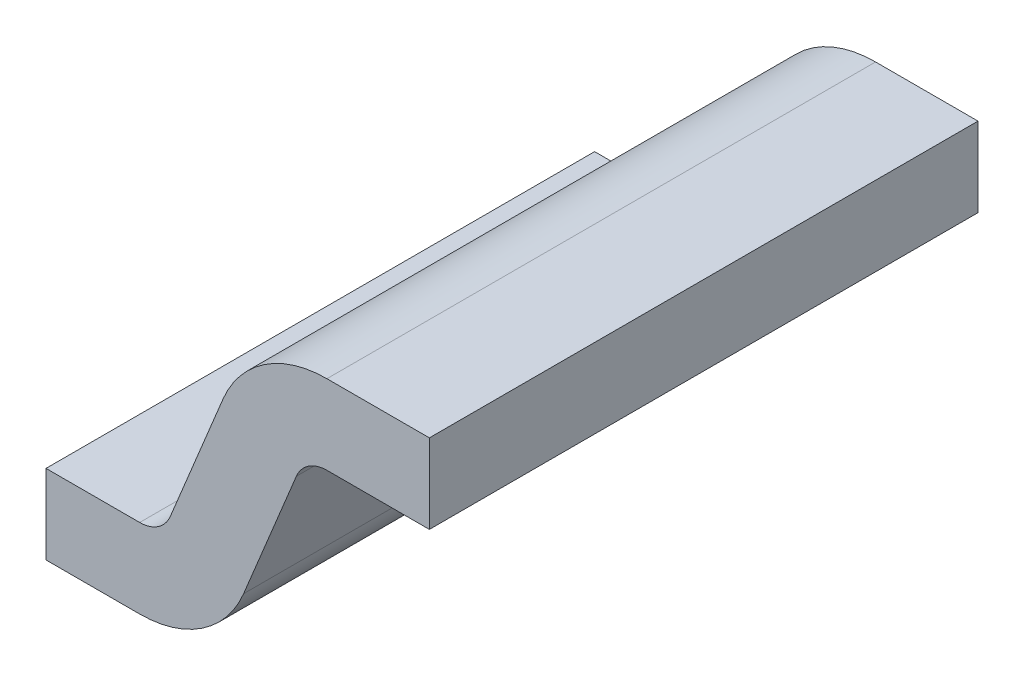
ISO-10303-21;
HEADER;
FILE_DESCRIPTION(('STEP AP214'),'2;1');
FILE_NAME('part.step','',(''),(''),'','','');
FILE_SCHEMA(('AUTOMOTIVE_DESIGN { 1 0 10303 214 1 1 1 1 }'));
ENDSEC;
DATA;
#1=APPLICATION_CONTEXT('core data for automotive mechanical design processes');
#2=APPLICATION_PROTOCOL_DEFINITION('international standard','automotive_design',2000,#1);
#3=PRODUCT_CONTEXT('',#1,'mechanical');
#4=PRODUCT('Part','Part','',(#3));
#5=PRODUCT_RELATED_PRODUCT_CATEGORY('part','',(#4));
#6=PRODUCT_DEFINITION_FORMATION('','',#4);
#7=PRODUCT_DEFINITION_CONTEXT('part definition',#1,'design');
#8=PRODUCT_DEFINITION('design','',#6,#7);
#9=PRODUCT_DEFINITION_SHAPE('','',#8);
#10=(LENGTH_UNIT() NAMED_UNIT(*) SI_UNIT(.MILLI.,.METRE.));
#11=(NAMED_UNIT(*) PLANE_ANGLE_UNIT() SI_UNIT($,.RADIAN.));
#12=(NAMED_UNIT(*) SI_UNIT($,.STERADIAN.) SOLID_ANGLE_UNIT());
#13=UNCERTAINTY_MEASURE_WITH_UNIT(LENGTH_MEASURE(1.E-05),#10,'distance_accuracy_value','');
#14=(GEOMETRIC_REPRESENTATION_CONTEXT(3) GLOBAL_UNCERTAINTY_ASSIGNED_CONTEXT((#13)) GLOBAL_UNIT_ASSIGNED_CONTEXT((#10,
#11,#12)) REPRESENTATION_CONTEXT('',''));
#15=CARTESIAN_POINT('',(0.,0.,0.));
#16=DIRECTION('',(0.,0.,1.));
#17=DIRECTION('',(1.,0.,0.));
#18=AXIS2_PLACEMENT_3D('',#15,#16,#17);
#19=CARTESIAN_POINT('',(-0.155,-0.05,0.));
#20=DIRECTION('',(0.,0.,1.));
#21=DIRECTION('',(1.,0.,0.));
#22=AXIS2_PLACEMENT_3D('',#19,#20,#21);
#23=PLANE('',#22);
#24=DIRECTION('',(0.,1.,0.));
#25=VECTOR('',#24,1.);
#26=CARTESIAN_POINT('',(0.,0.12,0.));
#27=LINE('',#26,#25);
#28=CARTESIAN_POINT('',(0.,0.,0.));
#29=VERTEX_POINT('',#28);
#30=CARTESIAN_POINT('',(0.,0.12,0.));
#31=VERTEX_POINT('',#30);
#32=EDGE_CURVE('E141',#29,#31,#27,.T.);
#33=ORIENTED_EDGE('',*,*,#32,.F.);
#34=DIRECTION('',(1.,0.,0.));
#35=VECTOR('',#34,1.);
#36=CARTESIAN_POINT('',(-0.155,0.,0.));
#37=LINE('',#36,#35);
#38=CARTESIAN_POINT('',(-0.155,0.,0.));
#39=VERTEX_POINT('',#38);
#40=EDGE_CURVE('E19',#39,#29,#37,.T.);
#41=ORIENTED_EDGE('',*,*,#40,.F.);
#42=CARTESIAN_POINT('',(-0.155,-0.05,0.));
#43=DIRECTION('',(0.,0.,-1.));
#44=DIRECTION('',(1.,0.,0.));
#45=AXIS2_PLACEMENT_3D('',#42,#43,#44);
#46=CIRCLE('',#45,0.05);
#47=CARTESIAN_POINT('',(-0.201231129660025,-0.0309557712060072,0.));
#48=VERTEX_POINT('',#47);
#49=EDGE_CURVE('E179',#48,#39,#46,.T.);
#50=ORIENTED_EDGE('',*,*,#49,.F.);
#51=DIRECTION('',(0.380884575879857,0.924622593200502,0.));
#52=VECTOR('',#51,1.);
#53=CARTESIAN_POINT('',(-0.281061946169478,-0.224750377899576,0.));
#54=LINE('',#53,#52);
#55=CARTESIAN_POINT('',(-0.281061946169478,-0.224750377899576,0.));
#56=VERTEX_POINT('',#55);
#57=EDGE_CURVE('E205',#56,#48,#54,.T.);
#58=ORIENTED_EDGE('',*,*,#57,.F.);
#59=CARTESIAN_POINT('',(-0.438247787013563,-0.16,0.));
#60=DIRECTION('',(0.,0.,1.));
#61=DIRECTION('',(1.,0.,0.));
#62=AXIS2_PLACEMENT_3D('',#59,#60,#61);
#63=CIRCLE('',#62,0.17);
#64=CARTESIAN_POINT('',(-0.438247787013563,-0.33,0.));
#65=VERTEX_POINT('',#64);
#66=EDGE_CURVE('E251',#65,#56,#63,.T.);
#67=ORIENTED_EDGE('',*,*,#66,.F.);
#68=DIRECTION('',(1.,0.,0.));
#69=VECTOR('',#68,1.);
#70=CARTESIAN_POINT('',(-0.58,-0.33,0.));
#71=LINE('',#70,#69);
#72=CARTESIAN_POINT('',(-0.58,-0.33,0.));
#73=VERTEX_POINT('',#72);
#74=EDGE_CURVE('E241',#73,#65,#71,.T.);
#75=ORIENTED_EDGE('',*,*,#74,.F.);
#76=DIRECTION('',(0.,-1.,0.));
#77=VECTOR('',#76,1.);
#78=CARTESIAN_POINT('',(-0.58,-0.21,0.));
#79=LINE('',#78,#77);
#80=CARTESIAN_POINT('',(-0.58,-0.21,0.));
#81=VERTEX_POINT('',#80);
#82=EDGE_CURVE('E228',#81,#73,#79,.T.);
#83=ORIENTED_EDGE('',*,*,#82,.F.);
#84=DIRECTION('',(-1.,0.,0.));
#85=VECTOR('',#84,1.);
#86=CARTESIAN_POINT('',(-0.438247787013563,-0.21,0.));
#87=LINE('',#86,#85);
#88=CARTESIAN_POINT('',(-0.438247787013563,-0.21,0.));
#89=VERTEX_POINT('',#88);
#90=EDGE_CURVE('E169',#89,#81,#87,.T.);
#91=ORIENTED_EDGE('',*,*,#90,.F.);
#92=CARTESIAN_POINT('',(-0.438247787013563,-0.16,0.));
#93=DIRECTION('',(0.,0.,-1.));
#94=DIRECTION('',(1.,0.,0.));
#95=AXIS2_PLACEMENT_3D('',#92,#93,#94);
#96=CIRCLE('',#95,0.05);
#97=CARTESIAN_POINT('',(-0.392016657353538,-0.179044228793993,0.));
#98=VERTEX_POINT('',#97);
#99=EDGE_CURVE('E197',#98,#89,#96,.T.);
#100=ORIENTED_EDGE('',*,*,#99,.F.);
#101=DIRECTION('',(-0.380884575879857,-0.924622593200502,0.));
#102=VECTOR('',#101,1.);
#103=CARTESIAN_POINT('',(-0.312185840844085,0.0147503778995758,0.));
#104=LINE('',#103,#102);
#105=CARTESIAN_POINT('',(-0.312185840844085,0.0147503778995758,0.));
#106=VERTEX_POINT('',#105);
#107=EDGE_CURVE('E198',#106,#98,#104,.T.);
#108=ORIENTED_EDGE('',*,*,#107,.F.);
#109=CARTESIAN_POINT('',(-0.155,-0.05,0.));
#110=DIRECTION('',(0.,0.,1.));
#111=DIRECTION('',(1.,0.,0.));
#112=AXIS2_PLACEMENT_3D('',#109,#110,#111);
#113=CIRCLE('',#112,0.17);
#114=CARTESIAN_POINT('',(-0.155,0.12,0.));
#115=VERTEX_POINT('',#114);
#116=EDGE_CURVE('E185',#115,#106,#113,.T.);
#117=ORIENTED_EDGE('',*,*,#116,.F.);
#118=DIRECTION('',(-1.,0.,0.));
#119=VECTOR('',#118,1.);
#120=CARTESIAN_POINT('',(0.,0.12,0.));
#121=LINE('',#120,#119);
#122=EDGE_CURVE('E150',#31,#115,#121,.T.);
#123=ORIENTED_EDGE('',*,*,#122,.F.);
#124=EDGE_LOOP('',(#33,#41,#50,#58,#67,#75,#83,#91,#100,#108,#117,#123));
#125=FACE_BOUND('',#124,.T.);
#126=ADVANCED_FACE('F16',(#125),#23,.F.);
#127=CARTESIAN_POINT('',(-0.155,-0.05,0.83));
#128=DIRECTION('',(0.,0.,1.));
#129=DIRECTION('',(1.,0.,0.));
#130=AXIS2_PLACEMENT_3D('',#127,#128,#129);
#131=PLANE('',#130);
#132=DIRECTION('',(0.,1.,0.));
#133=VECTOR('',#132,1.);
#134=CARTESIAN_POINT('',(0.,0.12,0.83));
#135=LINE('',#134,#133);
#136=CARTESIAN_POINT('',(0.,0.,0.83));
#137=VERTEX_POINT('',#136);
#138=CARTESIAN_POINT('',(0.,0.12,0.83));
#139=VERTEX_POINT('',#138);
#140=EDGE_CURVE('E144',#137,#139,#135,.T.);
#141=ORIENTED_EDGE('',*,*,#140,.T.);
#142=DIRECTION('',(-1.,0.,0.));
#143=VECTOR('',#142,1.);
#144=CARTESIAN_POINT('',(0.,0.12,0.83));
#145=LINE('',#144,#143);
#146=CARTESIAN_POINT('',(-0.155,0.12,0.83));
#147=VERTEX_POINT('',#146);
#148=EDGE_CURVE('E174',#139,#147,#145,.T.);
#149=ORIENTED_EDGE('',*,*,#148,.T.);
#150=CARTESIAN_POINT('',(-0.155,-0.05,0.83));
#151=DIRECTION('',(0.,0.,1.));
#152=DIRECTION('',(1.,0.,0.));
#153=AXIS2_PLACEMENT_3D('',#150,#151,#152);
#154=CIRCLE('',#153,0.17);
#155=CARTESIAN_POINT('',(-0.312185840844085,0.0147503778995758,0.83));
#156=VERTEX_POINT('',#155);
#157=EDGE_CURVE('E188',#147,#156,#154,.T.);
#158=ORIENTED_EDGE('',*,*,#157,.T.);
#159=DIRECTION('',(-0.380884575879857,-0.924622593200502,0.));
#160=VECTOR('',#159,1.);
#161=CARTESIAN_POINT('',(-0.312185840844085,0.0147503778995758,0.83));
#162=LINE('',#161,#160);
#163=CARTESIAN_POINT('',(-0.392016657353538,-0.179044228793993,0.83));
#164=VERTEX_POINT('',#163);
#165=EDGE_CURVE('E203',#156,#164,#162,.T.);
#166=ORIENTED_EDGE('',*,*,#165,.T.);
#167=CARTESIAN_POINT('',(-0.438247787013563,-0.16,0.83));
#168=DIRECTION('',(0.,0.,-1.));
#169=DIRECTION('',(1.,0.,0.));
#170=AXIS2_PLACEMENT_3D('',#167,#168,#169);
#171=CIRCLE('',#170,0.05);
#172=CARTESIAN_POINT('',(-0.438247787013563,-0.21,0.83));
#173=VERTEX_POINT('',#172);
#174=EDGE_CURVE('E163',#164,#173,#171,.T.);
#175=ORIENTED_EDGE('',*,*,#174,.T.);
#176=DIRECTION('',(-1.,0.,0.));
#177=VECTOR('',#176,1.);
#178=CARTESIAN_POINT('',(-0.438247787013563,-0.21,0.83));
#179=LINE('',#178,#177);
#180=CARTESIAN_POINT('',(-0.58,-0.21,0.83));
#181=VERTEX_POINT('',#180);
#182=EDGE_CURVE('E223',#173,#181,#179,.T.);
#183=ORIENTED_EDGE('',*,*,#182,.T.);
#184=DIRECTION('',(0.,-1.,0.));
#185=VECTOR('',#184,1.);
#186=CARTESIAN_POINT('',(-0.58,-0.21,0.83));
#187=LINE('',#186,#185);
#188=CARTESIAN_POINT('',(-0.58,-0.33,0.83));
#189=VERTEX_POINT('',#188);
#190=EDGE_CURVE('E236',#181,#189,#187,.T.);
#191=ORIENTED_EDGE('',*,*,#190,.T.);
#192=DIRECTION('',(1.,0.,0.));
#193=VECTOR('',#192,1.);
#194=CARTESIAN_POINT('',(-0.58,-0.33,0.83));
#195=LINE('',#194,#193);
#196=CARTESIAN_POINT('',(-0.438247787013563,-0.33,0.83));
#197=VERTEX_POINT('',#196);
#198=EDGE_CURVE('E247',#189,#197,#195,.T.);
#199=ORIENTED_EDGE('',*,*,#198,.T.);
#200=CARTESIAN_POINT('',(-0.438247787013563,-0.16,0.83));
#201=DIRECTION('',(0.,0.,1.));
#202=DIRECTION('',(1.,0.,0.));
#203=AXIS2_PLACEMENT_3D('',#200,#201,#202);
#204=CIRCLE('',#203,0.17);
#205=CARTESIAN_POINT('',(-0.281061946169478,-0.224750377899576,0.83));
#206=VERTEX_POINT('',#205);
#207=EDGE_CURVE('E210',#197,#206,#204,.T.);
#208=ORIENTED_EDGE('',*,*,#207,.T.);
#209=DIRECTION('',(0.380884575879857,0.924622593200502,0.));
#210=VECTOR('',#209,1.);
#211=CARTESIAN_POINT('',(-0.281061946169478,-0.224750377899576,0.83));
#212=LINE('',#211,#210);
#213=CARTESIAN_POINT('',(-0.201231129660025,-0.0309557712060072,0.83));
#214=VERTEX_POINT('',#213);
#215=EDGE_CURVE('E270',#206,#214,#212,.T.);
#216=ORIENTED_EDGE('',*,*,#215,.T.);
#217=CARTESIAN_POINT('',(-0.155,-0.05,0.83));
#218=DIRECTION('',(0.,0.,-1.));
#219=DIRECTION('',(1.,0.,0.));
#220=AXIS2_PLACEMENT_3D('',#217,#218,#219);
#221=CIRCLE('',#220,0.05);
#222=CARTESIAN_POINT('',(-0.155,0.,0.83));
#223=VERTEX_POINT('',#222);
#224=EDGE_CURVE('E138',#214,#223,#221,.T.);
#225=ORIENTED_EDGE('',*,*,#224,.T.);
#226=DIRECTION('',(1.,0.,0.));
#227=VECTOR('',#226,1.);
#228=CARTESIAN_POINT('',(-0.155,0.,0.83));
#229=LINE('',#228,#227);
#230=EDGE_CURVE('E11',#223,#137,#229,.T.);
#231=ORIENTED_EDGE('',*,*,#230,.T.);
#232=EDGE_LOOP('',(#141,#149,#158,#166,#175,#183,#191,#199,#208,#216,#225,#231));
#233=FACE_BOUND('',#232,.T.);
#234=ADVANCED_FACE('F304',(#233),#131,.T.);
#235=CARTESIAN_POINT('',(-0.155,0.,0.83));
#236=DIRECTION('',(0.,1.,0.));
#237=DIRECTION('',(1.,0.,0.));
#238=AXIS2_PLACEMENT_3D('',#235,#236,#237);
#239=PLANE('',#238);
#240=ORIENTED_EDGE('',*,*,#40,.T.);
#241=DIRECTION('',(0.,0.,-1.));
#242=VECTOR('',#241,1.);
#243=CARTESIAN_POINT('',(0.,0.,0.83));
#244=LINE('',#243,#242);
#245=EDGE_CURVE('E135',#137,#29,#244,.T.);
#246=ORIENTED_EDGE('',*,*,#245,.F.);
#247=ORIENTED_EDGE('',*,*,#230,.F.);
#248=DIRECTION('',(0.,0.,-1.));
#249=VECTOR('',#248,1.);
#250=CARTESIAN_POINT('',(-0.155,0.,0.83));
#251=LINE('',#250,#249);
#252=EDGE_CURVE('E134',#223,#39,#251,.T.);
#253=ORIENTED_EDGE('',*,*,#252,.T.);
#254=EDGE_LOOP('',(#240,#246,#247,#253));
#255=FACE_BOUND('',#254,.T.);
#256=ADVANCED_FACE('F131',(#255),#239,.F.);
#257=CARTESIAN_POINT('',(-0.155,-0.05,0.83));
#258=DIRECTION('',(0.,0.,-1.));
#259=DIRECTION('',(-1.,0.,0.));
#260=AXIS2_PLACEMENT_3D('',#257,#258,#259);
#261=CYLINDRICAL_SURFACE('',#260,0.05);
#262=ORIENTED_EDGE('',*,*,#49,.T.);
#263=ORIENTED_EDGE('',*,*,#252,.F.);
#264=ORIENTED_EDGE('',*,*,#224,.F.);
#265=DIRECTION('',(0.,0.,-1.));
#266=VECTOR('',#265,1.);
#267=CARTESIAN_POINT('',(-0.201231129660025,-0.0309557712060072,0.83));
#268=LINE('',#267,#266);
#269=EDGE_CURVE('E206',#214,#48,#268,.T.);
#270=ORIENTED_EDGE('',*,*,#269,.T.);
#271=EDGE_LOOP('',(#262,#263,#264,#270));
#272=FACE_BOUND('',#271,.T.);
#273=ADVANCED_FACE('F273',(#272),#261,.F.);
#274=CARTESIAN_POINT('',(-0.281061946169478,-0.224750377899576,0.83));
#275=DIRECTION('',(-0.924622593200502,0.380884575879857,0.));
#276=DIRECTION('',(0.,0.,1.));
#277=AXIS2_PLACEMENT_3D('',#274,#275,#276);
#278=PLANE('',#277);
#279=ORIENTED_EDGE('',*,*,#57,.T.);
#280=ORIENTED_EDGE('',*,*,#269,.F.);
#281=ORIENTED_EDGE('',*,*,#215,.F.);
#282=DIRECTION('',(0.,0.,-1.));
#283=VECTOR('',#282,1.);
#284=CARTESIAN_POINT('',(-0.281061946169478,-0.224750377899576,0.83));
#285=LINE('',#284,#283);
#286=EDGE_CURVE('E260',#206,#56,#285,.T.);
#287=ORIENTED_EDGE('',*,*,#286,.T.);
#288=EDGE_LOOP('',(#279,#280,#281,#287));
#289=FACE_BOUND('',#288,.T.);
#290=ADVANCED_FACE('F279',(#289),#278,.F.);
#291=CARTESIAN_POINT('',(-0.438247787013563,-0.16,0.83));
#292=DIRECTION('',(0.,0.,-1.));
#293=DIRECTION('',(-1.,0.,0.));
#294=AXIS2_PLACEMENT_3D('',#291,#292,#293);
#295=CYLINDRICAL_SURFACE('',#294,0.17);
#296=ORIENTED_EDGE('',*,*,#66,.T.);
#297=ORIENTED_EDGE('',*,*,#286,.F.);
#298=ORIENTED_EDGE('',*,*,#207,.F.);
#299=DIRECTION('',(0.,0.,-1.));
#300=VECTOR('',#299,1.);
#301=CARTESIAN_POINT('',(-0.438247787013563,-0.33,0.83));
#302=LINE('',#301,#300);
#303=EDGE_CURVE('E244',#197,#65,#302,.T.);
#304=ORIENTED_EDGE('',*,*,#303,.T.);
#305=EDGE_LOOP('',(#296,#297,#298,#304));
#306=FACE_BOUND('',#305,.T.);
#307=ADVANCED_FACE('F278',(#306),#295,.T.);
#308=CARTESIAN_POINT('',(-0.58,-0.33,0.83));
#309=DIRECTION('',(0.,1.,0.));
#310=DIRECTION('',(1.,0.,0.));
#311=AXIS2_PLACEMENT_3D('',#308,#309,#310);
#312=PLANE('',#311);
#313=ORIENTED_EDGE('',*,*,#74,.T.);
#314=ORIENTED_EDGE('',*,*,#303,.F.);
#315=ORIENTED_EDGE('',*,*,#198,.F.);
#316=DIRECTION('',(0.,0.,-1.));
#317=VECTOR('',#316,1.);
#318=CARTESIAN_POINT('',(-0.58,-0.33,0.83));
#319=LINE('',#318,#317);
#320=EDGE_CURVE('E233',#189,#73,#319,.T.);
#321=ORIENTED_EDGE('',*,*,#320,.T.);
#322=EDGE_LOOP('',(#313,#314,#315,#321));
#323=FACE_BOUND('',#322,.T.);
#324=ADVANCED_FACE('F284',(#323),#312,.F.);
#325=CARTESIAN_POINT('',(-0.58,-0.21,0.83));
#326=DIRECTION('',(1.,0.,0.));
#327=DIRECTION('',(0.,1.,0.));
#328=AXIS2_PLACEMENT_3D('',#325,#326,#327);
#329=PLANE('',#328);
#330=ORIENTED_EDGE('',*,*,#82,.T.);
#331=ORIENTED_EDGE('',*,*,#320,.F.);
#332=ORIENTED_EDGE('',*,*,#190,.F.);
#333=DIRECTION('',(0.,0.,-1.));
#334=VECTOR('',#333,1.);
#335=CARTESIAN_POINT('',(-0.58,-0.21,0.83));
#336=LINE('',#335,#334);
#337=EDGE_CURVE('E222',#181,#81,#336,.T.);
#338=ORIENTED_EDGE('',*,*,#337,.T.);
#339=EDGE_LOOP('',(#330,#331,#332,#338));
#340=FACE_BOUND('',#339,.T.);
#341=ADVANCED_FACE('F288',(#340),#329,.F.);
#342=CARTESIAN_POINT('',(-0.438247787013563,-0.21,0.83));
#343=DIRECTION('',(0.,-1.,0.));
#344=DIRECTION('',(0.,0.,-1.));
#345=AXIS2_PLACEMENT_3D('',#342,#343,#344);
#346=PLANE('',#345);
#347=ORIENTED_EDGE('',*,*,#90,.T.);
#348=ORIENTED_EDGE('',*,*,#337,.F.);
#349=ORIENTED_EDGE('',*,*,#182,.F.);
#350=DIRECTION('',(0.,0.,-1.));
#351=VECTOR('',#350,1.);
#352=CARTESIAN_POINT('',(-0.438247787013563,-0.21,0.83));
#353=LINE('',#352,#351);
#354=EDGE_CURVE('E161',#173,#89,#353,.T.);
#355=ORIENTED_EDGE('',*,*,#354,.T.);
#356=EDGE_LOOP('',(#347,#348,#349,#355));
#357=FACE_BOUND('',#356,.T.);
#358=ADVANCED_FACE('F289',(#357),#346,.F.);
#359=CARTESIAN_POINT('',(-0.438247787013563,-0.16,0.83));
#360=DIRECTION('',(0.,0.,-1.));
#361=DIRECTION('',(-1.,0.,0.));
#362=AXIS2_PLACEMENT_3D('',#359,#360,#361);
#363=CYLINDRICAL_SURFACE('',#362,0.05);
#364=ORIENTED_EDGE('',*,*,#99,.T.);
#365=ORIENTED_EDGE('',*,*,#354,.F.);
#366=ORIENTED_EDGE('',*,*,#174,.F.);
#367=DIRECTION('',(0.,0.,-1.));
#368=VECTOR('',#367,1.);
#369=CARTESIAN_POINT('',(-0.392016657353538,-0.179044228793993,0.83));
#370=LINE('',#369,#368);
#371=EDGE_CURVE('E211',#164,#98,#370,.T.);
#372=ORIENTED_EDGE('',*,*,#371,.T.);
#373=EDGE_LOOP('',(#364,#365,#366,#372));
#374=FACE_BOUND('',#373,.T.);
#375=ADVANCED_FACE('F292',(#374),#363,.F.);
#376=CARTESIAN_POINT('',(-0.312185840844085,0.0147503778995758,0.83));
#377=DIRECTION('',(0.924622593200502,-0.380884575879857,0.));
#378=DIRECTION('',(0.,0.,-1.));
#379=AXIS2_PLACEMENT_3D('',#376,#377,#378);
#380=PLANE('',#379);
#381=ORIENTED_EDGE('',*,*,#107,.T.);
#382=ORIENTED_EDGE('',*,*,#371,.F.);
#383=ORIENTED_EDGE('',*,*,#165,.F.);
#384=DIRECTION('',(0.,0.,-1.));
#385=VECTOR('',#384,1.);
#386=CARTESIAN_POINT('',(-0.312185840844085,0.0147503778995758,0.83));
#387=LINE('',#386,#385);
#388=EDGE_CURVE('E184',#156,#106,#387,.T.);
#389=ORIENTED_EDGE('',*,*,#388,.T.);
#390=EDGE_LOOP('',(#381,#382,#383,#389));
#391=FACE_BOUND('',#390,.T.);
#392=ADVANCED_FACE('F297',(#391),#380,.F.);
#393=CARTESIAN_POINT('',(-0.155,-0.05,0.83));
#394=DIRECTION('',(0.,0.,-1.));
#395=DIRECTION('',(-1.,0.,0.));
#396=AXIS2_PLACEMENT_3D('',#393,#394,#395);
#397=CYLINDRICAL_SURFACE('',#396,0.17);
#398=ORIENTED_EDGE('',*,*,#116,.T.);
#399=ORIENTED_EDGE('',*,*,#388,.F.);
#400=ORIENTED_EDGE('',*,*,#157,.F.);
#401=DIRECTION('',(0.,0.,-1.));
#402=VECTOR('',#401,1.);
#403=CARTESIAN_POINT('',(-0.155,0.12,0.83));
#404=LINE('',#403,#402);
#405=EDGE_CURVE('E166',#147,#115,#404,.T.);
#406=ORIENTED_EDGE('',*,*,#405,.T.);
#407=EDGE_LOOP('',(#398,#399,#400,#406));
#408=FACE_BOUND('',#407,.T.);
#409=ADVANCED_FACE('F299',(#408),#397,.T.);
#410=CARTESIAN_POINT('',(0.,0.12,0.83));
#411=DIRECTION('',(0.,-1.,0.));
#412=DIRECTION('',(0.,0.,-1.));
#413=AXIS2_PLACEMENT_3D('',#410,#411,#412);
#414=PLANE('',#413);
#415=ORIENTED_EDGE('',*,*,#122,.T.);
#416=ORIENTED_EDGE('',*,*,#405,.F.);
#417=ORIENTED_EDGE('',*,*,#148,.F.);
#418=DIRECTION('',(0.,0.,-1.));
#419=VECTOR('',#418,1.);
#420=CARTESIAN_POINT('',(0.,0.12,0.83));
#421=LINE('',#420,#419);
#422=EDGE_CURVE('E155',#139,#31,#421,.T.);
#423=ORIENTED_EDGE('',*,*,#422,.T.);
#424=EDGE_LOOP('',(#415,#416,#417,#423));
#425=FACE_BOUND('',#424,.T.);
#426=ADVANCED_FACE('F303',(#425),#414,.F.);
#427=CARTESIAN_POINT('',(0.,0.12,0.83));
#428=DIRECTION('',(-1.,0.,0.));
#429=DIRECTION('',(0.,0.,1.));
#430=AXIS2_PLACEMENT_3D('',#427,#428,#429);
#431=PLANE('',#430);
#432=ORIENTED_EDGE('',*,*,#32,.T.);
#433=ORIENTED_EDGE('',*,*,#422,.F.);
#434=ORIENTED_EDGE('',*,*,#140,.F.);
#435=ORIENTED_EDGE('',*,*,#245,.T.);
#436=EDGE_LOOP('',(#432,#433,#434,#435));
#437=FACE_BOUND('',#436,.T.);
#438=ADVANCED_FACE('F143',(#437),#431,.F.);
#439=CLOSED_SHELL('',(#126,#234,#256,#273,#290,#307,#324,#341,#358,#375,#392,#409,#426,#438));
#440=MANIFOLD_SOLID_BREP('B1',#439);
#441=ADVANCED_BREP_SHAPE_REPRESENTATION('',(#18,#440),#14);
#442=SHAPE_DEFINITION_REPRESENTATION(#9,#441);
ENDSEC;
END-ISO-10303-21;
